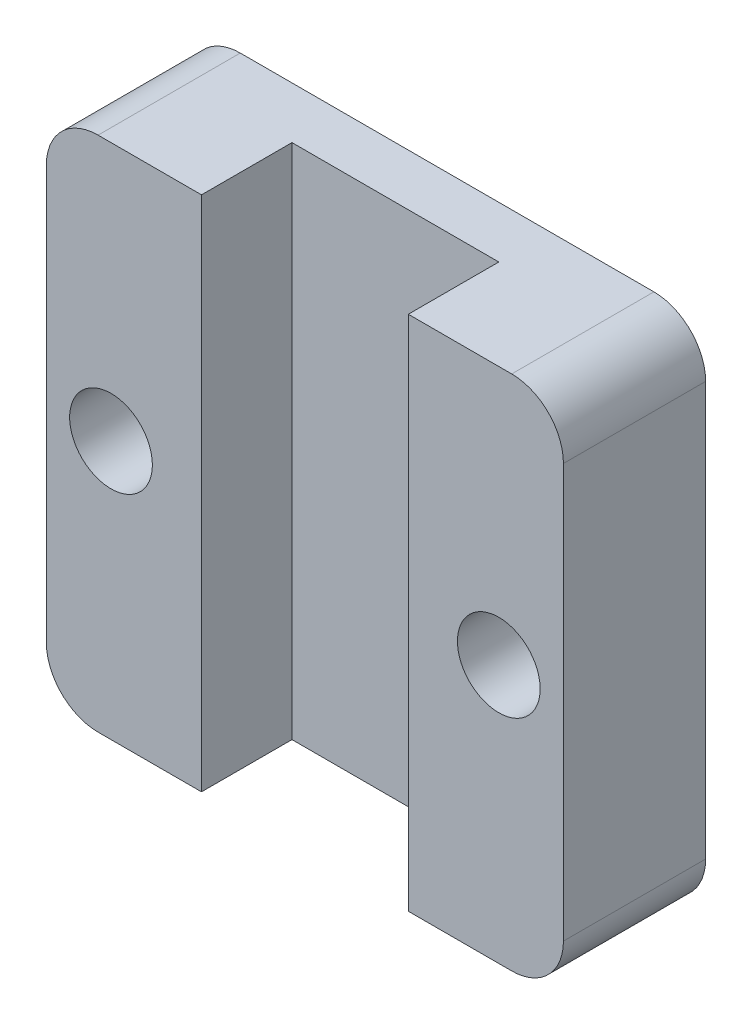
ISO-10303-21;
HEADER;
FILE_DESCRIPTION(('STEP AP214'),'2;1');
FILE_NAME('part.step','',(''),(''),'','','');
FILE_SCHEMA(('AUTOMOTIVE_DESIGN { 1 0 10303 214 1 1 1 1 }'));
ENDSEC;
DATA;
#1=APPLICATION_CONTEXT('core data for automotive mechanical design processes');
#2=APPLICATION_PROTOCOL_DEFINITION('international standard','automotive_design',2000,#1);
#3=PRODUCT_CONTEXT('',#1,'mechanical');
#4=PRODUCT('Part','Part','',(#3));
#5=PRODUCT_RELATED_PRODUCT_CATEGORY('part','',(#4));
#6=PRODUCT_DEFINITION_FORMATION('','',#4);
#7=PRODUCT_DEFINITION_CONTEXT('part definition',#1,'design');
#8=PRODUCT_DEFINITION('design','',#6,#7);
#9=PRODUCT_DEFINITION_SHAPE('','',#8);
#10=(LENGTH_UNIT() NAMED_UNIT(*) SI_UNIT(.MILLI.,.METRE.));
#11=(NAMED_UNIT(*) PLANE_ANGLE_UNIT() SI_UNIT($,.RADIAN.));
#12=(NAMED_UNIT(*) SI_UNIT($,.STERADIAN.) SOLID_ANGLE_UNIT());
#13=UNCERTAINTY_MEASURE_WITH_UNIT(LENGTH_MEASURE(1.E-05),#10,'distance_accuracy_value','');
#14=(GEOMETRIC_REPRESENTATION_CONTEXT(3) GLOBAL_UNCERTAINTY_ASSIGNED_CONTEXT((#13)) GLOBAL_UNIT_ASSIGNED_CONTEXT((#10,
#11,#12)) REPRESENTATION_CONTEXT('',''));
#15=CARTESIAN_POINT('',(0.,0.,0.));
#16=DIRECTION('',(0.,0.,1.));
#17=DIRECTION('',(1.,0.,0.));
#18=AXIS2_PLACEMENT_3D('',#15,#16,#17);
#19=CARTESIAN_POINT('',(0.,0.,5.5));
#20=DIRECTION('',(0.,0.,-1.));
#21=DIRECTION('',(-1.,0.,0.));
#22=AXIS2_PLACEMENT_3D('',#19,#20,#21);
#23=PLANE('',#22);
#24=CARTESIAN_POINT('',(-7.5,0.,5.5));
#25=DIRECTION('',(0.,0.,1.));
#26=DIRECTION('',(1.,0.,0.));
#27=AXIS2_PLACEMENT_3D('',#24,#25,#26);
#28=CIRCLE('',#27,1.59999999999999);
#29=CARTESIAN_POINT('',(-5.90000000000001,0.,5.5));
#30=VERTEX_POINT('',#29);
#31=EDGE_CURVE('E243',#30,#30,#28,.T.);
#32=ORIENTED_EDGE('',*,*,#31,.F.);
#33=EDGE_LOOP('',(#32));
#34=FACE_BOUND('',#33,.T.);
#35=DIRECTION('',(1.,0.,0.));
#36=VECTOR('',#35,1.);
#37=CARTESIAN_POINT('',(-10.,10.,5.5));
#38=LINE('',#37,#36);
#39=CARTESIAN_POINT('',(-8.,10.,5.5));
#40=VERTEX_POINT('',#39);
#41=CARTESIAN_POINT('',(-4.,10.,5.5));
#42=VERTEX_POINT('',#41);
#43=EDGE_CURVE('E160',#40,#42,#38,.T.);
#44=ORIENTED_EDGE('',*,*,#43,.F.);
#45=CARTESIAN_POINT('',(-8.,8.,5.5));
#46=DIRECTION('',(0.,0.,-1.));
#47=DIRECTION('',(-1.,0.,0.));
#48=AXIS2_PLACEMENT_3D('',#45,#46,#47);
#49=CIRCLE('',#48,2.);
#50=CARTESIAN_POINT('',(-10.,8.,5.5));
#51=VERTEX_POINT('',#50);
#52=EDGE_CURVE('E196',#40,#51,#49,.F.);
#53=ORIENTED_EDGE('',*,*,#52,.T.);
#54=DIRECTION('',(0.,1.,0.));
#55=VECTOR('',#54,1.);
#56=CARTESIAN_POINT('',(-10.,-10.,5.5));
#57=LINE('',#56,#55);
#58=CARTESIAN_POINT('',(-10.,-8.,5.5));
#59=VERTEX_POINT('',#58);
#60=EDGE_CURVE('E177',#59,#51,#57,.T.);
#61=ORIENTED_EDGE('',*,*,#60,.F.);
#62=CARTESIAN_POINT('',(-8.,-8.,5.5));
#63=DIRECTION('',(0.,0.,-1.));
#64=DIRECTION('',(-1.,0.,0.));
#65=AXIS2_PLACEMENT_3D('',#62,#63,#64);
#66=CIRCLE('',#65,2.);
#67=CARTESIAN_POINT('',(-8.,-10.,5.5));
#68=VERTEX_POINT('',#67);
#69=EDGE_CURVE('E155',#59,#68,#66,.F.);
#70=ORIENTED_EDGE('',*,*,#69,.T.);
#71=DIRECTION('',(-1.,0.,0.));
#72=VECTOR('',#71,1.);
#73=CARTESIAN_POINT('',(10.,-10.,5.5));
#74=LINE('',#73,#72);
#75=CARTESIAN_POINT('',(-4.,-10.,5.5));
#76=VERTEX_POINT('',#75);
#77=EDGE_CURVE('E146',#76,#68,#74,.T.);
#78=ORIENTED_EDGE('',*,*,#77,.F.);
#79=DIRECTION('',(0.,1.,0.));
#80=VECTOR('',#79,1.);
#81=CARTESIAN_POINT('',(-4.,-10.,5.5));
#82=LINE('',#81,#80);
#83=EDGE_CURVE('E129',#76,#42,#82,.T.);
#84=ORIENTED_EDGE('',*,*,#83,.T.);
#85=EDGE_LOOP('',(#44,#53,#61,#70,#78,#84));
#86=FACE_BOUND('',#85,.T.);
#87=ADVANCED_FACE('F39',(#34,#86),#23,.F.);
#88=CARTESIAN_POINT('',(-10.,-10.,5.5));
#89=DIRECTION('',(-1.,0.,0.));
#90=DIRECTION('',(0.,0.,1.));
#91=AXIS2_PLACEMENT_3D('',#88,#89,#90);
#92=PLANE('',#91);
#93=ORIENTED_EDGE('',*,*,#60,.T.);
#94=DIRECTION('',(0.,0.,-1.));
#95=VECTOR('',#94,1.);
#96=CARTESIAN_POINT('',(-10.,8.,5.5));
#97=LINE('',#96,#95);
#98=CARTESIAN_POINT('',(-10.,8.,0.));
#99=VERTEX_POINT('',#98);
#100=EDGE_CURVE('E179',#51,#99,#97,.T.);
#101=ORIENTED_EDGE('',*,*,#100,.T.);
#102=DIRECTION('',(0.,1.,0.));
#103=VECTOR('',#102,1.);
#104=CARTESIAN_POINT('',(-10.,-10.,0.));
#105=LINE('',#104,#103);
#106=CARTESIAN_POINT('',(-10.,-8.,0.));
#107=VERTEX_POINT('',#106);
#108=EDGE_CURVE('E164',#107,#99,#105,.T.);
#109=ORIENTED_EDGE('',*,*,#108,.F.);
#110=DIRECTION('',(0.,0.,-1.));
#111=VECTOR('',#110,1.);
#112=CARTESIAN_POINT('',(-10.,-8.,5.5));
#113=LINE('',#112,#111);
#114=EDGE_CURVE('E159',#107,#59,#113,.F.);
#115=ORIENTED_EDGE('',*,*,#114,.T.);
#116=EDGE_LOOP('',(#93,#101,#109,#115));
#117=FACE_BOUND('',#116,.T.);
#118=ADVANCED_FACE('F267',(#117),#92,.T.);
#119=CARTESIAN_POINT('',(10.,-10.,5.5));
#120=DIRECTION('',(0.,-1.,0.));
#121=DIRECTION('',(1.,0.,0.));
#122=AXIS2_PLACEMENT_3D('',#119,#120,#121);
#123=PLANE('',#122);
#124=ORIENTED_EDGE('',*,*,#77,.T.);
#125=DIRECTION('',(0.,0.,-1.));
#126=VECTOR('',#125,1.);
#127=CARTESIAN_POINT('',(-8.,-10.,5.5));
#128=LINE('',#127,#126);
#129=CARTESIAN_POINT('',(-8.,-10.,0.));
#130=VERTEX_POINT('',#129);
#131=EDGE_CURVE('E200',#68,#130,#128,.T.);
#132=ORIENTED_EDGE('',*,*,#131,.T.);
#133=DIRECTION('',(-1.,0.,0.));
#134=VECTOR('',#133,1.);
#135=CARTESIAN_POINT('',(10.,-10.,0.));
#136=LINE('',#135,#134);
#137=CARTESIAN_POINT('',(8.,-10.,0.));
#138=VERTEX_POINT('',#137);
#139=EDGE_CURVE('E174',#138,#130,#136,.T.);
#140=ORIENTED_EDGE('',*,*,#139,.F.);
#141=DIRECTION('',(0.,0.,-1.));
#142=VECTOR('',#141,1.);
#143=CARTESIAN_POINT('',(8.,-10.,5.5));
#144=LINE('',#143,#142);
#145=CARTESIAN_POINT('',(8.,-10.,5.5));
#146=VERTEX_POINT('',#145);
#147=EDGE_CURVE('E198',#138,#146,#144,.F.);
#148=ORIENTED_EDGE('',*,*,#147,.T.);
#149=CARTESIAN_POINT('',(4.,-10.,5.5));
#150=VERTEX_POINT('',#149);
#151=EDGE_CURVE('E156',#146,#150,#74,.T.);
#152=ORIENTED_EDGE('',*,*,#151,.T.);
#153=DIRECTION('',(0.,0.,-1.));
#154=VECTOR('',#153,1.);
#155=CARTESIAN_POINT('',(4.,-10.,5.5));
#156=LINE('',#155,#154);
#157=CARTESIAN_POINT('',(4.,-10.,2.));
#158=VERTEX_POINT('',#157);
#159=EDGE_CURVE('E150',#150,#158,#156,.T.);
#160=ORIENTED_EDGE('',*,*,#159,.T.);
#161=DIRECTION('',(-1.,0.,0.));
#162=VECTOR('',#161,1.);
#163=CARTESIAN_POINT('',(4.,-10.,2.));
#164=LINE('',#163,#162);
#165=CARTESIAN_POINT('',(-4.,-10.,2.));
#166=VERTEX_POINT('',#165);
#167=EDGE_CURVE('E140',#158,#166,#164,.T.);
#168=ORIENTED_EDGE('',*,*,#167,.T.);
#169=DIRECTION('',(0.,0.,1.));
#170=VECTOR('',#169,1.);
#171=CARTESIAN_POINT('',(-4.,-10.,2.));
#172=LINE('',#171,#170);
#173=EDGE_CURVE('E132',#166,#76,#172,.T.);
#174=ORIENTED_EDGE('',*,*,#173,.T.);
#175=EDGE_LOOP('',(#124,#132,#140,#148,#152,#160,#168,#174));
#176=FACE_BOUND('',#175,.T.);
#177=ADVANCED_FACE('F144',(#176),#123,.T.);
#178=CARTESIAN_POINT('',(10.,10.,5.5));
#179=DIRECTION('',(1.,0.,0.));
#180=DIRECTION('',(0.,0.,-1.));
#181=AXIS2_PLACEMENT_3D('',#178,#179,#180);
#182=PLANE('',#181);
#183=DIRECTION('',(0.,-1.,0.));
#184=VECTOR('',#183,1.);
#185=CARTESIAN_POINT('',(10.,10.,0.));
#186=LINE('',#185,#184);
#187=CARTESIAN_POINT('',(10.,8.,0.));
#188=VERTEX_POINT('',#187);
#189=CARTESIAN_POINT('',(10.,-8.,0.));
#190=VERTEX_POINT('',#189);
#191=EDGE_CURVE('E171',#188,#190,#186,.T.);
#192=ORIENTED_EDGE('',*,*,#191,.F.);
#193=DIRECTION('',(0.,0.,-1.));
#194=VECTOR('',#193,1.);
#195=CARTESIAN_POINT('',(10.,8.,5.5));
#196=LINE('',#195,#194);
#197=CARTESIAN_POINT('',(10.,8.,5.5));
#198=VERTEX_POINT('',#197);
#199=EDGE_CURVE('E60',#188,#198,#196,.F.);
#200=ORIENTED_EDGE('',*,*,#199,.T.);
#201=DIRECTION('',(0.,-1.,0.));
#202=VECTOR('',#201,1.);
#203=CARTESIAN_POINT('',(10.,10.,5.5));
#204=LINE('',#203,#202);
#205=CARTESIAN_POINT('',(10.,-8.,5.5));
#206=VERTEX_POINT('',#205);
#207=EDGE_CURVE('E157',#198,#206,#204,.T.);
#208=ORIENTED_EDGE('',*,*,#207,.T.);
#209=DIRECTION('',(0.,0.,-1.));
#210=VECTOR('',#209,1.);
#211=CARTESIAN_POINT('',(10.,-8.,5.5));
#212=LINE('',#211,#210);
#213=EDGE_CURVE('E202',#206,#190,#212,.T.);
#214=ORIENTED_EDGE('',*,*,#213,.T.);
#215=EDGE_LOOP('',(#192,#200,#208,#214));
#216=FACE_BOUND('',#215,.T.);
#217=ADVANCED_FACE('F206',(#216),#182,.T.);
#218=CARTESIAN_POINT('',(-10.,10.,5.5));
#219=DIRECTION('',(0.,1.,0.));
#220=DIRECTION('',(-1.,0.,0.));
#221=AXIS2_PLACEMENT_3D('',#218,#219,#220);
#222=PLANE('',#221);
#223=DIRECTION('',(1.,0.,0.));
#224=VECTOR('',#223,1.);
#225=CARTESIAN_POINT('',(-10.,10.,0.));
#226=LINE('',#225,#224);
#227=CARTESIAN_POINT('',(-8.,10.,0.));
#228=VERTEX_POINT('',#227);
#229=CARTESIAN_POINT('',(8.,10.,0.));
#230=VERTEX_POINT('',#229);
#231=EDGE_CURVE('E167',#228,#230,#226,.T.);
#232=ORIENTED_EDGE('',*,*,#231,.F.);
#233=DIRECTION('',(0.,0.,-1.));
#234=VECTOR('',#233,1.);
#235=CARTESIAN_POINT('',(-8.,10.,5.5));
#236=LINE('',#235,#234);
#237=EDGE_CURVE('E193',#228,#40,#236,.F.);
#238=ORIENTED_EDGE('',*,*,#237,.T.);
#239=ORIENTED_EDGE('',*,*,#43,.T.);
#240=DIRECTION('',(0.,0.,1.));
#241=VECTOR('',#240,1.);
#242=CARTESIAN_POINT('',(-4.,10.,2.));
#243=LINE('',#242,#241);
#244=CARTESIAN_POINT('',(-4.,10.,2.));
#245=VERTEX_POINT('',#244);
#246=EDGE_CURVE('E135',#245,#42,#243,.T.);
#247=ORIENTED_EDGE('',*,*,#246,.F.);
#248=DIRECTION('',(-1.,0.,0.));
#249=VECTOR('',#248,1.);
#250=CARTESIAN_POINT('',(4.,10.,2.));
#251=LINE('',#250,#249);
#252=CARTESIAN_POINT('',(4.,10.,2.));
#253=VERTEX_POINT('',#252);
#254=EDGE_CURVE('E151',#253,#245,#251,.T.);
#255=ORIENTED_EDGE('',*,*,#254,.F.);
#256=DIRECTION('',(0.,0.,-1.));
#257=VECTOR('',#256,1.);
#258=CARTESIAN_POINT('',(4.,10.,5.5));
#259=LINE('',#258,#257);
#260=CARTESIAN_POINT('',(4.,10.,5.5));
#261=VERTEX_POINT('',#260);
#262=EDGE_CURVE('E225',#261,#253,#259,.T.);
#263=ORIENTED_EDGE('',*,*,#262,.F.);
#264=CARTESIAN_POINT('',(8.,10.,5.5));
#265=VERTEX_POINT('',#264);
#266=EDGE_CURVE('E222',#261,#265,#38,.T.);
#267=ORIENTED_EDGE('',*,*,#266,.T.);
#268=DIRECTION('',(0.,0.,-1.));
#269=VECTOR('',#268,1.);
#270=CARTESIAN_POINT('',(8.,10.,5.5));
#271=LINE('',#270,#269);
#272=EDGE_CURVE('E190',#265,#230,#271,.T.);
#273=ORIENTED_EDGE('',*,*,#272,.T.);
#274=EDGE_LOOP('',(#232,#238,#239,#247,#255,#263,#267,#273));
#275=FACE_BOUND('',#274,.T.);
#276=ADVANCED_FACE('F218',(#275),#222,.T.);
#277=CARTESIAN_POINT('',(7.5,0.,5.5));
#278=DIRECTION('',(0.,0.,1.));
#279=DIRECTION('',(1.,0.,0.));
#280=AXIS2_PLACEMENT_3D('',#277,#278,#279);
#281=CIRCLE('',#280,1.59999999999999);
#282=CARTESIAN_POINT('',(9.09999999999999,0.,5.5));
#283=VERTEX_POINT('',#282);
#284=EDGE_CURVE('E249',#283,#283,#281,.T.);
#285=ORIENTED_EDGE('',*,*,#284,.F.);
#286=EDGE_LOOP('',(#285));
#287=FACE_BOUND('',#286,.T.);
#288=ORIENTED_EDGE('',*,*,#207,.F.);
#289=CARTESIAN_POINT('',(8.,8.,5.5));
#290=DIRECTION('',(0.,0.,-1.));
#291=DIRECTION('',(-1.,0.,0.));
#292=AXIS2_PLACEMENT_3D('',#289,#290,#291);
#293=CIRCLE('',#292,2.);
#294=EDGE_CURVE('E11',#198,#265,#293,.F.);
#295=ORIENTED_EDGE('',*,*,#294,.T.);
#296=ORIENTED_EDGE('',*,*,#266,.F.);
#297=DIRECTION('',(0.,1.,0.));
#298=VECTOR('',#297,1.);
#299=CARTESIAN_POINT('',(4.,-10.,5.5));
#300=LINE('',#299,#298);
#301=EDGE_CURVE('E139',#150,#261,#300,.T.);
#302=ORIENTED_EDGE('',*,*,#301,.F.);
#303=ORIENTED_EDGE('',*,*,#151,.F.);
#304=CARTESIAN_POINT('',(8.,-8.,5.5));
#305=DIRECTION('',(0.,0.,-1.));
#306=DIRECTION('',(-1.,0.,0.));
#307=AXIS2_PLACEMENT_3D('',#304,#305,#306);
#308=CIRCLE('',#307,2.);
#309=EDGE_CURVE('E47',#146,#206,#308,.F.);
#310=ORIENTED_EDGE('',*,*,#309,.T.);
#311=EDGE_LOOP('',(#288,#295,#296,#302,#303,#310));
#312=FACE_BOUND('',#311,.T.);
#313=ADVANCED_FACE('F255',(#287,#312),#23,.F.);
#314=CARTESIAN_POINT('',(0.,0.,0.));
#315=DIRECTION('',(0.,0.,-1.));
#316=DIRECTION('',(-1.,0.,0.));
#317=AXIS2_PLACEMENT_3D('',#314,#315,#316);
#318=PLANE('',#317);
#319=CARTESIAN_POINT('',(7.5,0.,0.));
#320=DIRECTION('',(0.,0.,1.));
#321=DIRECTION('',(1.,0.,0.));
#322=AXIS2_PLACEMENT_3D('',#319,#320,#321);
#323=CIRCLE('',#322,1.59999999999999);
#324=CARTESIAN_POINT('',(9.09999999999999,0.,0.));
#325=VERTEX_POINT('',#324);
#326=EDGE_CURVE('E246',#325,#325,#323,.T.);
#327=ORIENTED_EDGE('',*,*,#326,.T.);
#328=EDGE_LOOP('',(#327));
#329=FACE_BOUND('',#328,.T.);
#330=CARTESIAN_POINT('',(-7.5,0.,0.));
#331=DIRECTION('',(0.,0.,1.));
#332=DIRECTION('',(1.,0.,0.));
#333=AXIS2_PLACEMENT_3D('',#330,#331,#332);
#334=CIRCLE('',#333,1.59999999999999);
#335=CARTESIAN_POINT('',(-5.90000000000001,0.,0.));
#336=VERTEX_POINT('',#335);
#337=EDGE_CURVE('E238',#336,#336,#334,.T.);
#338=ORIENTED_EDGE('',*,*,#337,.T.);
#339=EDGE_LOOP('',(#338));
#340=FACE_BOUND('',#339,.T.);
#341=ORIENTED_EDGE('',*,*,#108,.T.);
#342=CARTESIAN_POINT('',(-8.,8.,0.));
#343=DIRECTION('',(0.,0.,-1.));
#344=DIRECTION('',(-1.,0.,0.));
#345=AXIS2_PLACEMENT_3D('',#342,#343,#344);
#346=CIRCLE('',#345,2.);
#347=EDGE_CURVE('E188',#99,#228,#346,.T.);
#348=ORIENTED_EDGE('',*,*,#347,.T.);
#349=ORIENTED_EDGE('',*,*,#231,.T.);
#350=CARTESIAN_POINT('',(8.,8.,0.));
#351=DIRECTION('',(0.,0.,-1.));
#352=DIRECTION('',(-1.,0.,0.));
#353=AXIS2_PLACEMENT_3D('',#350,#351,#352);
#354=CIRCLE('',#353,2.);
#355=EDGE_CURVE('E184',#230,#188,#354,.T.);
#356=ORIENTED_EDGE('',*,*,#355,.T.);
#357=ORIENTED_EDGE('',*,*,#191,.T.);
#358=CARTESIAN_POINT('',(8.,-8.,0.));
#359=DIRECTION('',(0.,0.,-1.));
#360=DIRECTION('',(-1.,0.,0.));
#361=AXIS2_PLACEMENT_3D('',#358,#359,#360);
#362=CIRCLE('',#361,2.);
#363=EDGE_CURVE('E182',#190,#138,#362,.T.);
#364=ORIENTED_EDGE('',*,*,#363,.T.);
#365=ORIENTED_EDGE('',*,*,#139,.T.);
#366=CARTESIAN_POINT('',(-8.,-8.,0.));
#367=DIRECTION('',(0.,0.,-1.));
#368=DIRECTION('',(-1.,0.,0.));
#369=AXIS2_PLACEMENT_3D('',#366,#367,#368);
#370=CIRCLE('',#369,2.);
#371=EDGE_CURVE('E186',#130,#107,#370,.T.);
#372=ORIENTED_EDGE('',*,*,#371,.T.);
#373=EDGE_LOOP('',(#341,#348,#349,#356,#357,#364,#365,#372));
#374=FACE_BOUND('',#373,.T.);
#375=ADVANCED_FACE('F209',(#329,#340,#374),#318,.T.);
#376=CARTESIAN_POINT('',(-4.,-10.,2.));
#377=DIRECTION('',(-1.,0.,0.));
#378=DIRECTION('',(0.,-1.,0.));
#379=AXIS2_PLACEMENT_3D('',#376,#377,#378);
#380=PLANE('',#379);
#381=ORIENTED_EDGE('',*,*,#246,.T.);
#382=ORIENTED_EDGE('',*,*,#83,.F.);
#383=ORIENTED_EDGE('',*,*,#173,.F.);
#384=DIRECTION('',(0.,1.,0.));
#385=VECTOR('',#384,1.);
#386=CARTESIAN_POINT('',(-4.,-10.,2.));
#387=LINE('',#386,#385);
#388=EDGE_CURVE('E168',#166,#245,#387,.T.);
#389=ORIENTED_EDGE('',*,*,#388,.T.);
#390=EDGE_LOOP('',(#381,#382,#383,#389));
#391=FACE_BOUND('',#390,.T.);
#392=ADVANCED_FACE('F131',(#391),#380,.F.);
#393=CARTESIAN_POINT('',(4.,-10.,2.));
#394=DIRECTION('',(0.,0.,-1.));
#395=DIRECTION('',(-1.,0.,0.));
#396=AXIS2_PLACEMENT_3D('',#393,#394,#395);
#397=PLANE('',#396);
#398=ORIENTED_EDGE('',*,*,#254,.T.);
#399=ORIENTED_EDGE('',*,*,#388,.F.);
#400=ORIENTED_EDGE('',*,*,#167,.F.);
#401=DIRECTION('',(0.,1.,0.));
#402=VECTOR('',#401,1.);
#403=CARTESIAN_POINT('',(4.,-10.,2.));
#404=LINE('',#403,#402);
#405=EDGE_CURVE('E231',#158,#253,#404,.T.);
#406=ORIENTED_EDGE('',*,*,#405,.T.);
#407=EDGE_LOOP('',(#398,#399,#400,#406));
#408=FACE_BOUND('',#407,.T.);
#409=ADVANCED_FACE('F288',(#408),#397,.F.);
#410=CARTESIAN_POINT('',(4.,-10.,5.5));
#411=DIRECTION('',(1.,0.,0.));
#412=DIRECTION('',(0.,1.,0.));
#413=AXIS2_PLACEMENT_3D('',#410,#411,#412);
#414=PLANE('',#413);
#415=ORIENTED_EDGE('',*,*,#262,.T.);
#416=ORIENTED_EDGE('',*,*,#405,.F.);
#417=ORIENTED_EDGE('',*,*,#159,.F.);
#418=ORIENTED_EDGE('',*,*,#301,.T.);
#419=EDGE_LOOP('',(#415,#416,#417,#418));
#420=FACE_BOUND('',#419,.T.);
#421=ADVANCED_FACE('F279',(#420),#414,.F.);
#422=CARTESIAN_POINT('',(-7.5,0.,5.5));
#423=DIRECTION('',(0.,0.,1.));
#424=DIRECTION('',(1.,0.,0.));
#425=AXIS2_PLACEMENT_3D('',#422,#423,#424);
#426=CYLINDRICAL_SURFACE('',#425,1.59999999999999);
#427=ORIENTED_EDGE('',*,*,#337,.F.);
#428=EDGE_LOOP('',(#427));
#429=FACE_BOUND('',#428,.T.);
#430=ORIENTED_EDGE('',*,*,#31,.T.);
#431=EDGE_LOOP('',(#430));
#432=FACE_BOUND('',#431,.T.);
#433=ADVANCED_FACE('F277',(#429,#432),#426,.F.);
#434=CARTESIAN_POINT('',(7.5,0.,5.5));
#435=DIRECTION('',(0.,0.,1.));
#436=DIRECTION('',(1.,0.,0.));
#437=AXIS2_PLACEMENT_3D('',#434,#435,#436);
#438=CYLINDRICAL_SURFACE('',#437,1.59999999999999);
#439=ORIENTED_EDGE('',*,*,#326,.F.);
#440=EDGE_LOOP('',(#439));
#441=FACE_BOUND('',#440,.T.);
#442=ORIENTED_EDGE('',*,*,#284,.T.);
#443=EDGE_LOOP('',(#442));
#444=FACE_BOUND('',#443,.T.);
#445=ADVANCED_FACE('F253',(#441,#444),#438,.F.);
#446=CARTESIAN_POINT('',(-8.,8.,5.5));
#447=DIRECTION('',(0.,0.,-1.));
#448=DIRECTION('',(-1.,0.,0.));
#449=AXIS2_PLACEMENT_3D('',#446,#447,#448);
#450=CYLINDRICAL_SURFACE('',#449,2.);
#451=ORIENTED_EDGE('',*,*,#52,.F.);
#452=ORIENTED_EDGE('',*,*,#237,.F.);
#453=ORIENTED_EDGE('',*,*,#347,.F.);
#454=ORIENTED_EDGE('',*,*,#100,.F.);
#455=EDGE_LOOP('',(#451,#452,#453,#454));
#456=FACE_BOUND('',#455,.T.);
#457=ADVANCED_FACE('F285',(#456),#450,.T.);
#458=CARTESIAN_POINT('',(-8.,-8.,5.5));
#459=DIRECTION('',(0.,0.,-1.));
#460=DIRECTION('',(-1.,0.,0.));
#461=AXIS2_PLACEMENT_3D('',#458,#459,#460);
#462=CYLINDRICAL_SURFACE('',#461,2.);
#463=ORIENTED_EDGE('',*,*,#69,.F.);
#464=ORIENTED_EDGE('',*,*,#114,.F.);
#465=ORIENTED_EDGE('',*,*,#371,.F.);
#466=ORIENTED_EDGE('',*,*,#131,.F.);
#467=EDGE_LOOP('',(#463,#464,#465,#466));
#468=FACE_BOUND('',#467,.T.);
#469=ADVANCED_FACE('F329',(#468),#462,.T.);
#470=CARTESIAN_POINT('',(8.,8.,5.5));
#471=DIRECTION('',(0.,0.,-1.));
#472=DIRECTION('',(-1.,0.,0.));
#473=AXIS2_PLACEMENT_3D('',#470,#471,#472);
#474=CYLINDRICAL_SURFACE('',#473,2.);
#475=ORIENTED_EDGE('',*,*,#294,.F.);
#476=ORIENTED_EDGE('',*,*,#199,.F.);
#477=ORIENTED_EDGE('',*,*,#355,.F.);
#478=ORIENTED_EDGE('',*,*,#272,.F.);
#479=EDGE_LOOP('',(#475,#476,#477,#478));
#480=FACE_BOUND('',#479,.T.);
#481=ADVANCED_FACE('F215',(#480),#474,.T.);
#482=CARTESIAN_POINT('',(8.,-8.,5.5));
#483=DIRECTION('',(0.,0.,-1.));
#484=DIRECTION('',(-1.,0.,0.));
#485=AXIS2_PLACEMENT_3D('',#482,#483,#484);
#486=CYLINDRICAL_SURFACE('',#485,2.);
#487=ORIENTED_EDGE('',*,*,#309,.F.);
#488=ORIENTED_EDGE('',*,*,#147,.F.);
#489=ORIENTED_EDGE('',*,*,#363,.F.);
#490=ORIENTED_EDGE('',*,*,#213,.F.);
#491=EDGE_LOOP('',(#487,#488,#489,#490));
#492=FACE_BOUND('',#491,.T.);
#493=ADVANCED_FACE('F41',(#492),#486,.T.);
#494=CLOSED_SHELL('',(#87,#118,#177,#217,#276,#313,#375,#392,#409,#421,#433,#445,#457,#469,#481,#493));
#495=MANIFOLD_SOLID_BREP('B2',#494);
#496=ADVANCED_BREP_SHAPE_REPRESENTATION('',(#18,#495),#14);
#497=SHAPE_DEFINITION_REPRESENTATION(#9,#496);
ENDSEC;
END-ISO-10303-21;
